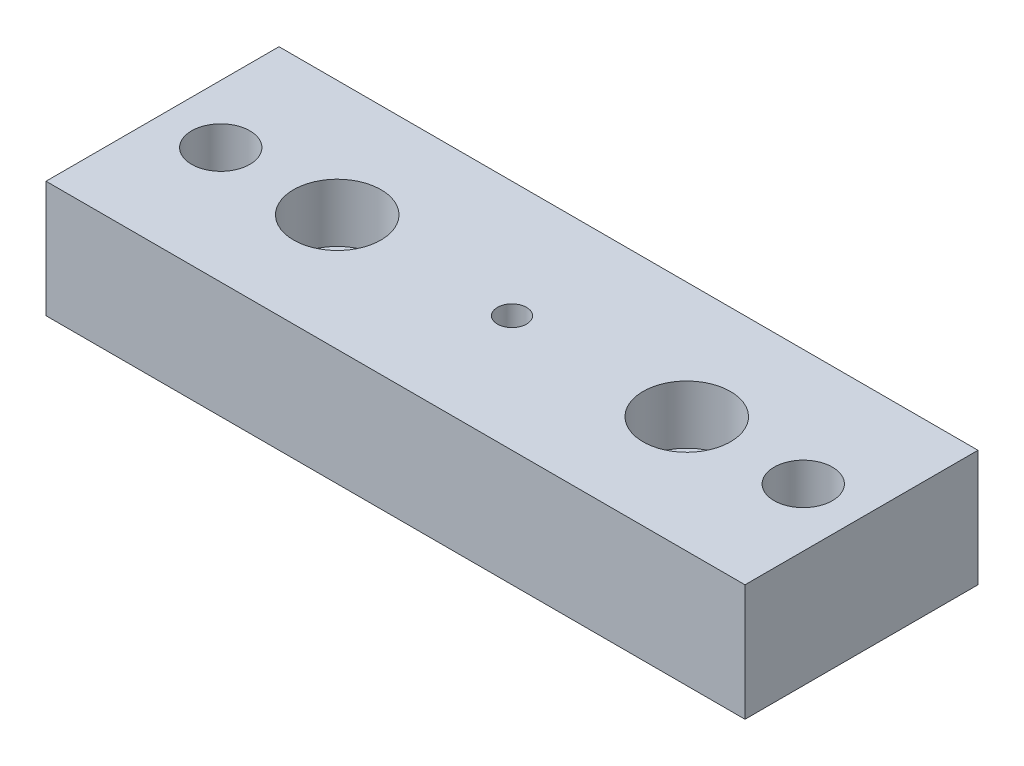
ISO-10303-21;
HEADER;
FILE_DESCRIPTION(('STEP AP214'),'2;1');
FILE_NAME('part.step','',(''),(''),'','','');
FILE_SCHEMA(('AUTOMOTIVE_DESIGN { 1 0 10303 214 1 1 1 1 }'));
ENDSEC;
DATA;
#1=APPLICATION_CONTEXT('core data for automotive mechanical design processes');
#2=APPLICATION_PROTOCOL_DEFINITION('international standard','automotive_design',2000,#1);
#3=PRODUCT_CONTEXT('',#1,'mechanical');
#4=PRODUCT('Part','Part','',(#3));
#5=PRODUCT_RELATED_PRODUCT_CATEGORY('part','',(#4));
#6=PRODUCT_DEFINITION_FORMATION('','',#4);
#7=PRODUCT_DEFINITION_CONTEXT('part definition',#1,'design');
#8=PRODUCT_DEFINITION('design','',#6,#7);
#9=PRODUCT_DEFINITION_SHAPE('','',#8);
#10=(LENGTH_UNIT() NAMED_UNIT(*) SI_UNIT(.MILLI.,.METRE.));
#11=(NAMED_UNIT(*) PLANE_ANGLE_UNIT() SI_UNIT($,.RADIAN.));
#12=(NAMED_UNIT(*) SI_UNIT($,.STERADIAN.) SOLID_ANGLE_UNIT());
#13=UNCERTAINTY_MEASURE_WITH_UNIT(LENGTH_MEASURE(1.E-05),#10,'distance_accuracy_value','');
#14=(GEOMETRIC_REPRESENTATION_CONTEXT(3) GLOBAL_UNCERTAINTY_ASSIGNED_CONTEXT((#13)) GLOBAL_UNIT_ASSIGNED_CONTEXT((#10,
#11,#12)) REPRESENTATION_CONTEXT('',''));
#15=CARTESIAN_POINT('',(0.,0.,0.));
#16=DIRECTION('',(0.,0.,1.));
#17=DIRECTION('',(1.,0.,0.));
#18=AXIS2_PLACEMENT_3D('',#15,#16,#17);
#19=CARTESIAN_POINT('',(-60.,20.,20.));
#20=DIRECTION('',(1.,0.,0.));
#21=DIRECTION('',(0.,0.,-1.));
#22=AXIS2_PLACEMENT_3D('',#19,#20,#21);
#23=PLANE('',#22);
#24=DIRECTION('',(0.,0.,1.));
#25=VECTOR('',#24,1.);
#26=CARTESIAN_POINT('',(-60.,0.,20.));
#27=LINE('',#26,#25);
#28=CARTESIAN_POINT('',(-60.,0.,-20.));
#29=VERTEX_POINT('',#28);
#30=CARTESIAN_POINT('',(-60.,0.,20.));
#31=VERTEX_POINT('',#30);
#32=EDGE_CURVE('E93',#29,#31,#27,.T.);
#33=ORIENTED_EDGE('',*,*,#32,.T.);
#34=DIRECTION('',(0.,-1.,0.));
#35=VECTOR('',#34,1.);
#36=CARTESIAN_POINT('',(-60.,20.,20.));
#37=LINE('',#36,#35);
#38=CARTESIAN_POINT('',(-60.,20.,20.));
#39=VERTEX_POINT('',#38);
#40=EDGE_CURVE('E11',#39,#31,#37,.T.);
#41=ORIENTED_EDGE('',*,*,#40,.F.);
#42=DIRECTION('',(0.,0.,1.));
#43=VECTOR('',#42,1.);
#44=CARTESIAN_POINT('',(-60.,20.,20.));
#45=LINE('',#44,#43);
#46=CARTESIAN_POINT('',(-60.,20.,-20.));
#47=VERTEX_POINT('',#46);
#48=EDGE_CURVE('E81',#47,#39,#45,.T.);
#49=ORIENTED_EDGE('',*,*,#48,.F.);
#50=DIRECTION('',(0.,-1.,0.));
#51=VECTOR('',#50,1.);
#52=CARTESIAN_POINT('',(-60.,20.,-20.));
#53=LINE('',#52,#51);
#54=EDGE_CURVE('E89',#47,#29,#53,.T.);
#55=ORIENTED_EDGE('',*,*,#54,.T.);
#56=EDGE_LOOP('',(#33,#41,#49,#55));
#57=FACE_BOUND('',#56,.T.);
#58=ADVANCED_FACE('F30',(#57),#23,.F.);
#59=CARTESIAN_POINT('',(60.,20.,20.));
#60=DIRECTION('',(0.,0.,-1.));
#61=DIRECTION('',(-1.,0.,0.));
#62=AXIS2_PLACEMENT_3D('',#59,#60,#61);
#63=PLANE('',#62);
#64=DIRECTION('',(1.,0.,0.));
#65=VECTOR('',#64,1.);
#66=CARTESIAN_POINT('',(60.,0.,20.));
#67=LINE('',#66,#65);
#68=CARTESIAN_POINT('',(60.,0.,20.));
#69=VERTEX_POINT('',#68);
#70=EDGE_CURVE('E85',#31,#69,#67,.T.);
#71=ORIENTED_EDGE('',*,*,#70,.T.);
#72=DIRECTION('',(0.,-1.,0.));
#73=VECTOR('',#72,1.);
#74=CARTESIAN_POINT('',(60.,20.,20.));
#75=LINE('',#74,#73);
#76=CARTESIAN_POINT('',(60.,20.,20.));
#77=VERTEX_POINT('',#76);
#78=EDGE_CURVE('E38',#77,#69,#75,.T.);
#79=ORIENTED_EDGE('',*,*,#78,.F.);
#80=DIRECTION('',(1.,0.,0.));
#81=VECTOR('',#80,1.);
#82=CARTESIAN_POINT('',(60.,20.,20.));
#83=LINE('',#82,#81);
#84=EDGE_CURVE('E76',#39,#77,#83,.T.);
#85=ORIENTED_EDGE('',*,*,#84,.F.);
#86=ORIENTED_EDGE('',*,*,#40,.T.);
#87=EDGE_LOOP('',(#71,#79,#85,#86));
#88=FACE_BOUND('',#87,.T.);
#89=ADVANCED_FACE('F84',(#88),#63,.F.);
#90=CARTESIAN_POINT('',(60.,20.,20.));
#91=DIRECTION('',(-1.,0.,0.));
#92=DIRECTION('',(0.,0.,1.));
#93=AXIS2_PLACEMENT_3D('',#90,#91,#92);
#94=PLANE('',#93);
#95=DIRECTION('',(0.,0.,-1.));
#96=VECTOR('',#95,1.);
#97=CARTESIAN_POINT('',(60.,0.,20.));
#98=LINE('',#97,#96);
#99=CARTESIAN_POINT('',(60.,0.,-20.));
#100=VERTEX_POINT('',#99);
#101=EDGE_CURVE('E63',#69,#100,#98,.T.);
#102=ORIENTED_EDGE('',*,*,#101,.T.);
#103=DIRECTION('',(0.,-1.,0.));
#104=VECTOR('',#103,1.);
#105=CARTESIAN_POINT('',(60.,20.,-20.));
#106=LINE('',#105,#104);
#107=CARTESIAN_POINT('',(60.,20.,-20.));
#108=VERTEX_POINT('',#107);
#109=EDGE_CURVE('E86',#108,#100,#106,.T.);
#110=ORIENTED_EDGE('',*,*,#109,.F.);
#111=DIRECTION('',(0.,0.,-1.));
#112=VECTOR('',#111,1.);
#113=CARTESIAN_POINT('',(60.,20.,20.));
#114=LINE('',#113,#112);
#115=EDGE_CURVE('E79',#77,#108,#114,.T.);
#116=ORIENTED_EDGE('',*,*,#115,.F.);
#117=ORIENTED_EDGE('',*,*,#78,.T.);
#118=EDGE_LOOP('',(#102,#110,#116,#117));
#119=FACE_BOUND('',#118,.T.);
#120=ADVANCED_FACE('F87',(#119),#94,.F.);
#121=CARTESIAN_POINT('',(60.,20.,-20.));
#122=DIRECTION('',(0.,0.,1.));
#123=DIRECTION('',(1.,0.,0.));
#124=AXIS2_PLACEMENT_3D('',#121,#122,#123);
#125=PLANE('',#124);
#126=DIRECTION('',(-1.,0.,0.));
#127=VECTOR('',#126,1.);
#128=CARTESIAN_POINT('',(60.,0.,-20.));
#129=LINE('',#128,#127);
#130=EDGE_CURVE('E69',#100,#29,#129,.T.);
#131=ORIENTED_EDGE('',*,*,#130,.T.);
#132=ORIENTED_EDGE('',*,*,#54,.F.);
#133=DIRECTION('',(-1.,0.,0.));
#134=VECTOR('',#133,1.);
#135=CARTESIAN_POINT('',(60.,20.,-20.));
#136=LINE('',#135,#134);
#137=EDGE_CURVE('E46',#108,#47,#136,.T.);
#138=ORIENTED_EDGE('',*,*,#137,.F.);
#139=ORIENTED_EDGE('',*,*,#109,.T.);
#140=EDGE_LOOP('',(#131,#132,#138,#139));
#141=FACE_BOUND('',#140,.T.);
#142=ADVANCED_FACE('F101',(#141),#125,.F.);
#143=CARTESIAN_POINT('',(-60.,20.,-20.));
#144=DIRECTION('',(0.,1.,0.));
#145=DIRECTION('',(0.,0.,1.));
#146=AXIS2_PLACEMENT_3D('',#143,#144,#145);
#147=PLANE('',#146);
#148=CARTESIAN_POINT('',(0.,20.,0.));
#149=DIRECTION('',(0.,1.,0.));
#150=DIRECTION('',(0.,0.,1.));
#151=AXIS2_PLACEMENT_3D('',#148,#149,#150);
#152=CIRCLE('',#151,2.5);
#153=CARTESIAN_POINT('',(0.,20.,2.5));
#154=VERTEX_POINT('',#153);
#155=EDGE_CURVE('E131',#154,#154,#152,.T.);
#156=ORIENTED_EDGE('',*,*,#155,.F.);
#157=EDGE_LOOP('',(#156));
#158=FACE_BOUND('',#157,.T.);
#159=CARTESIAN_POINT('',(30.,20.,0.));
#160=DIRECTION('',(0.,1.,0.));
#161=DIRECTION('',(0.,0.,-1.));
#162=AXIS2_PLACEMENT_3D('',#159,#160,#161);
#163=CIRCLE('',#162,7.5);
#164=CARTESIAN_POINT('',(30.,20.,-7.50000000000003));
#165=VERTEX_POINT('',#164);
#166=EDGE_CURVE('E125',#165,#165,#163,.T.);
#167=ORIENTED_EDGE('',*,*,#166,.F.);
#168=EDGE_LOOP('',(#167));
#169=FACE_BOUND('',#168,.T.);
#170=CARTESIAN_POINT('',(-30.,20.,0.));
#171=DIRECTION('',(0.,1.,0.));
#172=DIRECTION('',(0.,0.,1.));
#173=AXIS2_PLACEMENT_3D('',#170,#171,#172);
#174=CIRCLE('',#173,7.5);
#175=CARTESIAN_POINT('',(-30.,20.,7.5));
#176=VERTEX_POINT('',#175);
#177=EDGE_CURVE('E119',#176,#176,#174,.T.);
#178=ORIENTED_EDGE('',*,*,#177,.F.);
#179=EDGE_LOOP('',(#178));
#180=FACE_BOUND('',#179,.T.);
#181=CARTESIAN_POINT('',(50.,20.,0.));
#182=DIRECTION('',(0.,1.,0.));
#183=DIRECTION('',(0.,0.,-1.));
#184=AXIS2_PLACEMENT_3D('',#181,#182,#183);
#185=CIRCLE('',#184,4.99999999999999);
#186=CARTESIAN_POINT('',(50.,20.,-5.00000000000006));
#187=VERTEX_POINT('',#186);
#188=EDGE_CURVE('E113',#187,#187,#185,.T.);
#189=ORIENTED_EDGE('',*,*,#188,.F.);
#190=EDGE_LOOP('',(#189));
#191=FACE_BOUND('',#190,.T.);
#192=CARTESIAN_POINT('',(-50.,20.,0.));
#193=DIRECTION('',(0.,1.,0.));
#194=DIRECTION('',(0.,0.,1.));
#195=AXIS2_PLACEMENT_3D('',#192,#193,#194);
#196=CIRCLE('',#195,5.);
#197=CARTESIAN_POINT('',(-50.,20.,5.));
#198=VERTEX_POINT('',#197);
#199=EDGE_CURVE('E107',#198,#198,#196,.T.);
#200=ORIENTED_EDGE('',*,*,#199,.F.);
#201=EDGE_LOOP('',(#200));
#202=FACE_BOUND('',#201,.T.);
#203=ORIENTED_EDGE('',*,*,#48,.T.);
#204=ORIENTED_EDGE('',*,*,#84,.T.);
#205=ORIENTED_EDGE('',*,*,#115,.T.);
#206=ORIENTED_EDGE('',*,*,#137,.T.);
#207=EDGE_LOOP('',(#203,#204,#205,#206));
#208=FACE_BOUND('',#207,.T.);
#209=ADVANCED_FACE('F77',(#158,#169,#180,#191,#202,#208),#147,.T.);
#210=CARTESIAN_POINT('',(-60.,0.,-20.));
#211=DIRECTION('',(0.,1.,0.));
#212=DIRECTION('',(0.,0.,1.));
#213=AXIS2_PLACEMENT_3D('',#210,#211,#212);
#214=PLANE('',#213);
#215=CARTESIAN_POINT('',(50.,0.,0.));
#216=DIRECTION('',(0.,1.,0.));
#217=DIRECTION('',(0.,0.,-1.));
#218=AXIS2_PLACEMENT_3D('',#215,#216,#217);
#219=CIRCLE('',#218,4.99999999999999);
#220=CARTESIAN_POINT('',(50.,0.,-5.00000000000006));
#221=VERTEX_POINT('',#220);
#222=EDGE_CURVE('E110',#221,#221,#219,.T.);
#223=ORIENTED_EDGE('',*,*,#222,.T.);
#224=EDGE_LOOP('',(#223));
#225=FACE_BOUND('',#224,.T.);
#226=CARTESIAN_POINT('',(-50.,0.,0.));
#227=DIRECTION('',(0.,1.,0.));
#228=DIRECTION('',(0.,0.,1.));
#229=AXIS2_PLACEMENT_3D('',#226,#227,#228);
#230=CIRCLE('',#229,5.);
#231=CARTESIAN_POINT('',(-50.,0.,5.));
#232=VERTEX_POINT('',#231);
#233=EDGE_CURVE('E96',#232,#232,#230,.T.);
#234=ORIENTED_EDGE('',*,*,#233,.T.);
#235=EDGE_LOOP('',(#234));
#236=FACE_BOUND('',#235,.T.);
#237=ORIENTED_EDGE('',*,*,#32,.F.);
#238=ORIENTED_EDGE('',*,*,#130,.F.);
#239=ORIENTED_EDGE('',*,*,#101,.F.);
#240=ORIENTED_EDGE('',*,*,#70,.F.);
#241=EDGE_LOOP('',(#237,#238,#239,#240));
#242=FACE_BOUND('',#241,.T.);
#243=ADVANCED_FACE('F104',(#225,#236,#242),#214,.F.);
#244=CARTESIAN_POINT('',(-50.,0.,0.));
#245=DIRECTION('',(0.,1.,0.));
#246=DIRECTION('',(0.,0.,1.));
#247=AXIS2_PLACEMENT_3D('',#244,#245,#246);
#248=CYLINDRICAL_SURFACE('',#247,5.);
#249=ORIENTED_EDGE('',*,*,#233,.F.);
#250=EDGE_LOOP('',(#249));
#251=FACE_BOUND('',#250,.T.);
#252=ORIENTED_EDGE('',*,*,#199,.T.);
#253=EDGE_LOOP('',(#252));
#254=FACE_BOUND('',#253,.T.);
#255=ADVANCED_FACE('F157',(#251,#254),#248,.F.);
#256=CARTESIAN_POINT('',(50.,0.,0.));
#257=DIRECTION('',(0.,1.,0.));
#258=DIRECTION('',(0.,0.,1.));
#259=AXIS2_PLACEMENT_3D('',#256,#257,#258);
#260=CYLINDRICAL_SURFACE('',#259,4.99999999999999);
#261=ORIENTED_EDGE('',*,*,#222,.F.);
#262=EDGE_LOOP('',(#261));
#263=FACE_BOUND('',#262,.T.);
#264=ORIENTED_EDGE('',*,*,#188,.T.);
#265=EDGE_LOOP('',(#264));
#266=FACE_BOUND('',#265,.T.);
#267=ADVANCED_FACE('F159',(#263,#266),#260,.F.);
#268=CARTESIAN_POINT('',(-30.,10.,0.));
#269=DIRECTION('',(0.,1.,0.));
#270=DIRECTION('',(0.,0.,1.));
#271=AXIS2_PLACEMENT_3D('',#268,#269,#270);
#272=CYLINDRICAL_SURFACE('',#271,7.5);
#273=CARTESIAN_POINT('',(-30.,10.,0.));
#274=DIRECTION('',(0.,1.,0.));
#275=DIRECTION('',(0.,0.,1.));
#276=AXIS2_PLACEMENT_3D('',#273,#274,#275);
#277=CIRCLE('',#276,7.5);
#278=CARTESIAN_POINT('',(-30.,10.,7.5));
#279=VERTEX_POINT('',#278);
#280=EDGE_CURVE('E116',#279,#279,#277,.T.);
#281=ORIENTED_EDGE('',*,*,#280,.F.);
#282=EDGE_LOOP('',(#281));
#283=FACE_BOUND('',#282,.T.);
#284=ORIENTED_EDGE('',*,*,#177,.T.);
#285=EDGE_LOOP('',(#284));
#286=FACE_BOUND('',#285,.T.);
#287=ADVANCED_FACE('F166',(#283,#286),#272,.F.);
#288=CARTESIAN_POINT('',(-30.,10.,0.));
#289=DIRECTION('',(0.,1.,0.));
#290=DIRECTION('',(0.,0.,1.));
#291=AXIS2_PLACEMENT_3D('',#288,#289,#290);
#292=PLANE('',#291);
#293=ORIENTED_EDGE('',*,*,#280,.T.);
#294=EDGE_LOOP('',(#293));
#295=FACE_BOUND('',#294,.T.);
#296=ADVANCED_FACE('F213',(#295),#292,.T.);
#297=CARTESIAN_POINT('',(30.,10.,0.));
#298=DIRECTION('',(0.,1.,0.));
#299=DIRECTION('',(0.,0.,1.));
#300=AXIS2_PLACEMENT_3D('',#297,#298,#299);
#301=CYLINDRICAL_SURFACE('',#300,7.5);
#302=CARTESIAN_POINT('',(30.,10.,0.));
#303=DIRECTION('',(0.,1.,0.));
#304=DIRECTION('',(0.,0.,-1.));
#305=AXIS2_PLACEMENT_3D('',#302,#303,#304);
#306=CIRCLE('',#305,7.5);
#307=CARTESIAN_POINT('',(30.,10.,-7.50000000000003));
#308=VERTEX_POINT('',#307);
#309=EDGE_CURVE('E122',#308,#308,#306,.T.);
#310=ORIENTED_EDGE('',*,*,#309,.F.);
#311=EDGE_LOOP('',(#310));
#312=FACE_BOUND('',#311,.T.);
#313=ORIENTED_EDGE('',*,*,#166,.T.);
#314=EDGE_LOOP('',(#313));
#315=FACE_BOUND('',#314,.T.);
#316=ADVANCED_FACE('F220',(#312,#315),#301,.F.);
#317=CARTESIAN_POINT('',(30.,10.,0.));
#318=DIRECTION('',(0.,-1.,0.));
#319=DIRECTION('',(0.,0.,-1.));
#320=AXIS2_PLACEMENT_3D('',#317,#318,#319);
#321=PLANE('',#320);
#322=ORIENTED_EDGE('',*,*,#309,.T.);
#323=EDGE_LOOP('',(#322));
#324=FACE_BOUND('',#323,.T.);
#325=ADVANCED_FACE('F142',(#324),#321,.F.);
#326=CARTESIAN_POINT('',(0.,10.,0.));
#327=DIRECTION('',(0.,1.,0.));
#328=DIRECTION('',(0.,0.,1.));
#329=AXIS2_PLACEMENT_3D('',#326,#327,#328);
#330=CYLINDRICAL_SURFACE('',#329,2.5);
#331=CARTESIAN_POINT('',(0.,10.,0.));
#332=DIRECTION('',(0.,1.,0.));
#333=DIRECTION('',(0.,0.,1.));
#334=AXIS2_PLACEMENT_3D('',#331,#332,#333);
#335=CIRCLE('',#334,2.5);
#336=CARTESIAN_POINT('',(0.,10.,2.5));
#337=VERTEX_POINT('',#336);
#338=EDGE_CURVE('E128',#337,#337,#335,.T.);
#339=ORIENTED_EDGE('',*,*,#338,.F.);
#340=EDGE_LOOP('',(#339));
#341=FACE_BOUND('',#340,.T.);
#342=ORIENTED_EDGE('',*,*,#155,.T.);
#343=EDGE_LOOP('',(#342));
#344=FACE_BOUND('',#343,.T.);
#345=ADVANCED_FACE('F139',(#341,#344),#330,.F.);
#346=CARTESIAN_POINT('',(0.,10.,0.));
#347=DIRECTION('',(0.,1.,0.));
#348=DIRECTION('',(0.,0.,1.));
#349=AXIS2_PLACEMENT_3D('',#346,#347,#348);
#350=PLANE('',#349);
#351=ORIENTED_EDGE('',*,*,#338,.T.);
#352=EDGE_LOOP('',(#351));
#353=FACE_BOUND('',#352,.T.);
#354=ADVANCED_FACE('F137',(#353),#350,.T.);
#355=CLOSED_SHELL('',(#58,#89,#120,#142,#209,#243,#255,#267,#287,#296,#316,#325,#345,#354));
#356=MANIFOLD_SOLID_BREP('B2',#355);
#357=ADVANCED_BREP_SHAPE_REPRESENTATION('',(#18,#356),#14);
#358=SHAPE_DEFINITION_REPRESENTATION(#9,#357);
ENDSEC;
END-ISO-10303-21;
